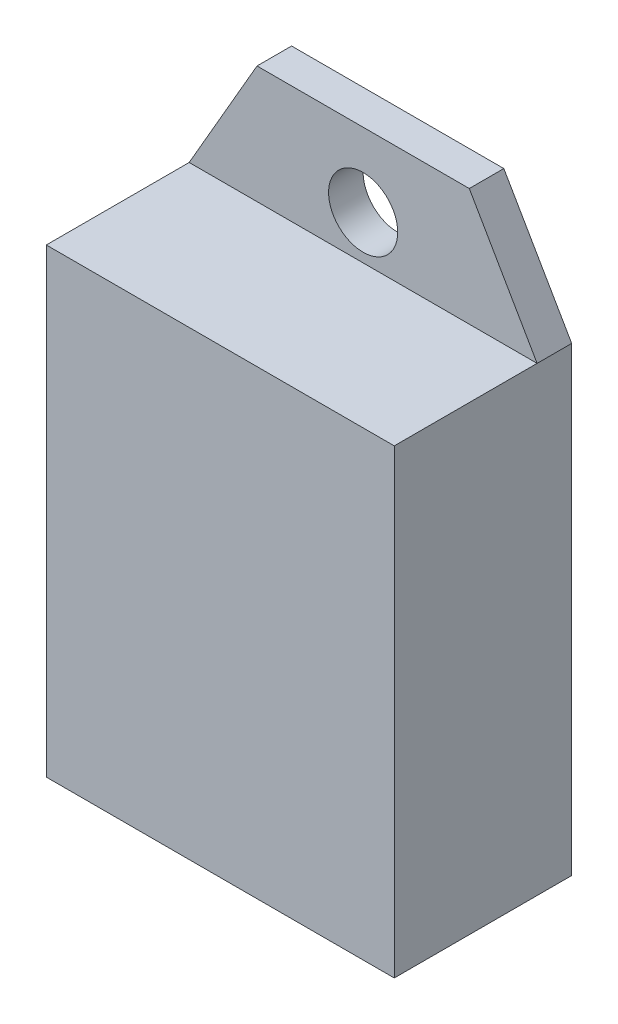
ISO-10303-21;
HEADER;
FILE_DESCRIPTION(('STEP AP214'),'2;1');
FILE_NAME('part.step','',(''),(''),'','','');
FILE_SCHEMA(('AUTOMOTIVE_DESIGN { 1 0 10303 214 1 1 1 1 }'));
ENDSEC;
DATA;
#1=APPLICATION_CONTEXT('core data for automotive mechanical design processes');
#2=APPLICATION_PROTOCOL_DEFINITION('international standard','automotive_design',2000,#1);
#3=PRODUCT_CONTEXT('',#1,'mechanical');
#4=PRODUCT('Part','Part','',(#3));
#5=PRODUCT_RELATED_PRODUCT_CATEGORY('part','',(#4));
#6=PRODUCT_DEFINITION_FORMATION('','',#4);
#7=PRODUCT_DEFINITION_CONTEXT('part definition',#1,'design');
#8=PRODUCT_DEFINITION('design','',#6,#7);
#9=PRODUCT_DEFINITION_SHAPE('','',#8);
#10=(LENGTH_UNIT() NAMED_UNIT(*) SI_UNIT(.MILLI.,.METRE.));
#11=(NAMED_UNIT(*) PLANE_ANGLE_UNIT() SI_UNIT($,.RADIAN.));
#12=(NAMED_UNIT(*) SI_UNIT($,.STERADIAN.) SOLID_ANGLE_UNIT());
#13=UNCERTAINTY_MEASURE_WITH_UNIT(LENGTH_MEASURE(1.E-05),#10,'distance_accuracy_value','');
#14=(GEOMETRIC_REPRESENTATION_CONTEXT(3) GLOBAL_UNCERTAINTY_ASSIGNED_CONTEXT((#13)) GLOBAL_UNIT_ASSIGNED_CONTEXT((#10,
#11,#12)) REPRESENTATION_CONTEXT('',''));
#15=CARTESIAN_POINT('',(0.,0.,0.));
#16=DIRECTION('',(0.,0.,1.));
#17=DIRECTION('',(1.,0.,0.));
#18=AXIS2_PLACEMENT_3D('',#15,#16,#17);
#19=CARTESIAN_POINT('',(7.55,-10.,7.7));
#20=DIRECTION('',(-1.,0.,0.));
#21=DIRECTION('',(0.,0.,1.));
#22=AXIS2_PLACEMENT_3D('',#19,#20,#21);
#23=PLANE('',#22);
#24=DIRECTION('',(0.,1.,0.));
#25=VECTOR('',#24,1.);
#26=CARTESIAN_POINT('',(7.55,-10.,0.));
#27=LINE('',#26,#25);
#28=CARTESIAN_POINT('',(7.55,-10.,0.));
#29=VERTEX_POINT('',#28);
#30=CARTESIAN_POINT('',(7.55,10.,0.));
#31=VERTEX_POINT('',#30);
#32=EDGE_CURVE('E121',#29,#31,#27,.T.);
#33=ORIENTED_EDGE('',*,*,#32,.T.);
#34=DIRECTION('',(0.,0.,-1.));
#35=VECTOR('',#34,1.);
#36=CARTESIAN_POINT('',(7.55,10.,1.5));
#37=LINE('',#36,#35);
#38=CARTESIAN_POINT('',(7.55,10.,1.5));
#39=VERTEX_POINT('',#38);
#40=EDGE_CURVE('E111',#39,#31,#37,.T.);
#41=ORIENTED_EDGE('',*,*,#40,.F.);
#42=DIRECTION('',(0.,0.,-1.));
#43=VECTOR('',#42,1.);
#44=CARTESIAN_POINT('',(7.55,10.,7.7));
#45=LINE('',#44,#43);
#46=CARTESIAN_POINT('',(7.55,10.,7.7));
#47=VERTEX_POINT('',#46);
#48=EDGE_CURVE('E11',#47,#39,#45,.T.);
#49=ORIENTED_EDGE('',*,*,#48,.F.);
#50=DIRECTION('',(0.,1.,0.));
#51=VECTOR('',#50,1.);
#52=CARTESIAN_POINT('',(7.55,-10.,7.7));
#53=LINE('',#52,#51);
#54=CARTESIAN_POINT('',(7.55,-10.,7.7));
#55=VERTEX_POINT('',#54);
#56=EDGE_CURVE('E187',#55,#47,#53,.T.);
#57=ORIENTED_EDGE('',*,*,#56,.F.);
#58=DIRECTION('',(0.,0.,-1.));
#59=VECTOR('',#58,1.);
#60=CARTESIAN_POINT('',(7.55,-10.,7.7));
#61=LINE('',#60,#59);
#62=EDGE_CURVE('E193',#55,#29,#61,.T.);
#63=ORIENTED_EDGE('',*,*,#62,.T.);
#64=EDGE_LOOP('',(#33,#41,#49,#57,#63));
#65=FACE_BOUND('',#64,.T.);
#66=ADVANCED_FACE('F33',(#65),#23,.F.);
#67=CARTESIAN_POINT('',(-7.55,10.,7.7));
#68=DIRECTION('',(0.,-1.,0.));
#69=DIRECTION('',(0.,0.,-1.));
#70=AXIS2_PLACEMENT_3D('',#67,#68,#69);
#71=PLANE('',#70);
#72=ORIENTED_EDGE('',*,*,#48,.T.);
#73=DIRECTION('',(-1.,0.,0.));
#74=VECTOR('',#73,1.);
#75=CARTESIAN_POINT('',(-7.55,10.,1.5));
#76=LINE('',#75,#74);
#77=CARTESIAN_POINT('',(-7.55,10.,1.5));
#78=VERTEX_POINT('',#77);
#79=EDGE_CURVE('E100',#39,#78,#76,.T.);
#80=ORIENTED_EDGE('',*,*,#79,.T.);
#81=DIRECTION('',(0.,0.,-1.));
#82=VECTOR('',#81,1.);
#83=CARTESIAN_POINT('',(-7.55,10.,7.7));
#84=LINE('',#83,#82);
#85=CARTESIAN_POINT('',(-7.55,10.,7.7));
#86=VERTEX_POINT('',#85);
#87=EDGE_CURVE('E40',#86,#78,#84,.T.);
#88=ORIENTED_EDGE('',*,*,#87,.F.);
#89=DIRECTION('',(-1.,0.,0.));
#90=VECTOR('',#89,1.);
#91=CARTESIAN_POINT('',(-7.55,10.,7.7));
#92=LINE('',#91,#90);
#93=EDGE_CURVE('E78',#47,#86,#92,.T.);
#94=ORIENTED_EDGE('',*,*,#93,.F.);
#95=EDGE_LOOP('',(#72,#80,#88,#94));
#96=FACE_BOUND('',#95,.T.);
#97=ADVANCED_FACE('F125',(#96),#71,.F.);
#98=CARTESIAN_POINT('',(-7.55,-10.,7.7));
#99=DIRECTION('',(1.,0.,0.));
#100=DIRECTION('',(0.,0.,-1.));
#101=AXIS2_PLACEMENT_3D('',#98,#99,#100);
#102=PLANE('',#101);
#103=DIRECTION('',(0.,-1.,0.));
#104=VECTOR('',#103,1.);
#105=CARTESIAN_POINT('',(-7.55,-10.,0.));
#106=LINE('',#105,#104);
#107=CARTESIAN_POINT('',(-7.55,10.,0.));
#108=VERTEX_POINT('',#107);
#109=CARTESIAN_POINT('',(-7.55,-10.,0.));
#110=VERTEX_POINT('',#109);
#111=EDGE_CURVE('E195',#108,#110,#106,.T.);
#112=ORIENTED_EDGE('',*,*,#111,.T.);
#113=DIRECTION('',(0.,0.,-1.));
#114=VECTOR('',#113,1.);
#115=CARTESIAN_POINT('',(-7.55,-10.,7.7));
#116=LINE('',#115,#114);
#117=CARTESIAN_POINT('',(-7.55,-10.,7.7));
#118=VERTEX_POINT('',#117);
#119=EDGE_CURVE('E199',#118,#110,#116,.T.);
#120=ORIENTED_EDGE('',*,*,#119,.F.);
#121=DIRECTION('',(0.,-1.,0.));
#122=VECTOR('',#121,1.);
#123=CARTESIAN_POINT('',(-7.55,-10.,7.7));
#124=LINE('',#123,#122);
#125=EDGE_CURVE('E190',#86,#118,#124,.T.);
#126=ORIENTED_EDGE('',*,*,#125,.F.);
#127=ORIENTED_EDGE('',*,*,#87,.T.);
#128=DIRECTION('',(0.,0.,-1.));
#129=VECTOR('',#128,1.);
#130=CARTESIAN_POINT('',(-7.55,10.,1.5));
#131=LINE('',#130,#129);
#132=EDGE_CURVE('E122',#78,#108,#131,.T.);
#133=ORIENTED_EDGE('',*,*,#132,.T.);
#134=EDGE_LOOP('',(#112,#120,#126,#127,#133));
#135=FACE_BOUND('',#134,.T.);
#136=ADVANCED_FACE('F127',(#135),#102,.F.);
#137=CARTESIAN_POINT('',(-7.55,-10.,7.7));
#138=DIRECTION('',(0.,1.,0.));
#139=DIRECTION('',(0.,0.,1.));
#140=AXIS2_PLACEMENT_3D('',#137,#138,#139);
#141=PLANE('',#140);
#142=DIRECTION('',(1.,0.,0.));
#143=VECTOR('',#142,1.);
#144=CARTESIAN_POINT('',(-7.55,-10.,0.));
#145=LINE('',#144,#143);
#146=EDGE_CURVE('E71',#110,#29,#145,.T.);
#147=ORIENTED_EDGE('',*,*,#146,.T.);
#148=ORIENTED_EDGE('',*,*,#62,.F.);
#149=DIRECTION('',(1.,0.,0.));
#150=VECTOR('',#149,1.);
#151=CARTESIAN_POINT('',(-7.55,-10.,7.7));
#152=LINE('',#151,#150);
#153=EDGE_CURVE('E56',#118,#55,#152,.T.);
#154=ORIENTED_EDGE('',*,*,#153,.F.);
#155=ORIENTED_EDGE('',*,*,#119,.T.);
#156=EDGE_LOOP('',(#147,#148,#154,#155));
#157=FACE_BOUND('',#156,.T.);
#158=ADVANCED_FACE('F132',(#157),#141,.F.);
#159=CARTESIAN_POINT('',(0.,0.,7.7));
#160=DIRECTION('',(0.,0.,-1.));
#161=DIRECTION('',(-1.,0.,0.));
#162=AXIS2_PLACEMENT_3D('',#159,#160,#161);
#163=PLANE('',#162);
#164=ORIENTED_EDGE('',*,*,#56,.T.);
#165=ORIENTED_EDGE('',*,*,#93,.T.);
#166=ORIENTED_EDGE('',*,*,#125,.T.);
#167=ORIENTED_EDGE('',*,*,#153,.T.);
#168=EDGE_LOOP('',(#164,#165,#166,#167));
#169=FACE_BOUND('',#168,.T.);
#170=ADVANCED_FACE('F138',(#169),#163,.F.);
#171=CARTESIAN_POINT('',(0.,0.,0.));
#172=DIRECTION('',(0.,0.,-1.));
#173=DIRECTION('',(-1.,0.,0.));
#174=AXIS2_PLACEMENT_3D('',#171,#172,#173);
#175=PLANE('',#174);
#176=CARTESIAN_POINT('',(0.,11.9,0.));
#177=DIRECTION('',(0.,0.,1.));
#178=DIRECTION('',(1.,0.,0.));
#179=AXIS2_PLACEMENT_3D('',#176,#177,#178);
#180=CIRCLE('',#179,1.5);
#181=CARTESIAN_POINT('',(1.5,11.9,0.));
#182=VERTEX_POINT('',#181);
#183=EDGE_CURVE('E166',#182,#182,#180,.T.);
#184=ORIENTED_EDGE('',*,*,#183,.T.);
#185=EDGE_LOOP('',(#184));
#186=FACE_BOUND('',#185,.T.);
#187=ORIENTED_EDGE('',*,*,#32,.F.);
#188=ORIENTED_EDGE('',*,*,#146,.F.);
#189=ORIENTED_EDGE('',*,*,#111,.F.);
#190=DIRECTION('',(0.500000000000004,0.866025403784437,0.));
#191=VECTOR('',#190,1.);
#192=CARTESIAN_POINT('',(-4.60551362713288,15.1,0.));
#193=LINE('',#192,#191);
#194=CARTESIAN_POINT('',(-4.60551362713288,15.1,0.));
#195=VERTEX_POINT('',#194);
#196=EDGE_CURVE('E177',#108,#195,#193,.T.);
#197=ORIENTED_EDGE('',*,*,#196,.T.);
#198=DIRECTION('',(1.,0.,0.));
#199=VECTOR('',#198,1.);
#200=CARTESIAN_POINT('',(-4.60551362713288,15.1,0.));
#201=LINE('',#200,#199);
#202=CARTESIAN_POINT('',(4.60551362713288,15.1,0.));
#203=VERTEX_POINT('',#202);
#204=EDGE_CURVE('E114',#195,#203,#201,.T.);
#205=ORIENTED_EDGE('',*,*,#204,.T.);
#206=DIRECTION('',(0.500000000000004,-0.866025403784436,0.));
#207=VECTOR('',#206,1.);
#208=CARTESIAN_POINT('',(4.60551362713288,15.1,0.));
#209=LINE('',#208,#207);
#210=EDGE_CURVE('E171',#203,#31,#209,.T.);
#211=ORIENTED_EDGE('',*,*,#210,.T.);
#212=EDGE_LOOP('',(#187,#188,#189,#197,#205,#211));
#213=FACE_BOUND('',#212,.T.);
#214=ADVANCED_FACE('F139',(#186,#213),#175,.T.);
#215=CARTESIAN_POINT('',(4.60551362713288,15.1,1.5));
#216=DIRECTION('',(0.866025403784436,0.500000000000004,0.));
#217=DIRECTION('',(-0.500000000000004,0.866025403784436,0.));
#218=AXIS2_PLACEMENT_3D('',#215,#216,#217);
#219=PLANE('',#218);
#220=ORIENTED_EDGE('',*,*,#210,.F.);
#221=DIRECTION('',(0.,0.,-1.));
#222=VECTOR('',#221,1.);
#223=CARTESIAN_POINT('',(4.60551362713288,15.1,1.5));
#224=LINE('',#223,#222);
#225=CARTESIAN_POINT('',(4.60551362713288,15.1,1.5));
#226=VERTEX_POINT('',#225);
#227=EDGE_CURVE('E113',#226,#203,#224,.T.);
#228=ORIENTED_EDGE('',*,*,#227,.F.);
#229=DIRECTION('',(0.500000000000004,-0.866025403784436,0.));
#230=VECTOR('',#229,1.);
#231=CARTESIAN_POINT('',(4.60551362713288,15.1,1.5));
#232=LINE('',#231,#230);
#233=EDGE_CURVE('E103',#226,#39,#232,.T.);
#234=ORIENTED_EDGE('',*,*,#233,.T.);
#235=ORIENTED_EDGE('',*,*,#40,.T.);
#236=EDGE_LOOP('',(#220,#228,#234,#235));
#237=FACE_BOUND('',#236,.T.);
#238=ADVANCED_FACE('F110',(#237),#219,.T.);
#239=CARTESIAN_POINT('',(-4.60551362713288,15.1,1.5));
#240=DIRECTION('',(0.,1.,0.));
#241=DIRECTION('',(-1.,0.,0.));
#242=AXIS2_PLACEMENT_3D('',#239,#240,#241);
#243=PLANE('',#242);
#244=ORIENTED_EDGE('',*,*,#204,.F.);
#245=DIRECTION('',(0.,0.,-1.));
#246=VECTOR('',#245,1.);
#247=CARTESIAN_POINT('',(-4.60551362713288,15.1,1.5));
#248=LINE('',#247,#246);
#249=CARTESIAN_POINT('',(-4.60551362713288,15.1,1.5));
#250=VERTEX_POINT('',#249);
#251=EDGE_CURVE('E183',#250,#195,#248,.T.);
#252=ORIENTED_EDGE('',*,*,#251,.F.);
#253=DIRECTION('',(1.,0.,0.));
#254=VECTOR('',#253,1.);
#255=CARTESIAN_POINT('',(-4.60551362713288,15.1,1.5));
#256=LINE('',#255,#254);
#257=EDGE_CURVE('E123',#250,#226,#256,.T.);
#258=ORIENTED_EDGE('',*,*,#257,.T.);
#259=ORIENTED_EDGE('',*,*,#227,.T.);
#260=EDGE_LOOP('',(#244,#252,#258,#259));
#261=FACE_BOUND('',#260,.T.);
#262=ADVANCED_FACE('F147',(#261),#243,.T.);
#263=CARTESIAN_POINT('',(-4.60551362713288,15.1,1.5));
#264=DIRECTION('',(-0.866025403784436,0.500000000000004,0.));
#265=DIRECTION('',(-0.500000000000004,-0.866025403784437,0.));
#266=AXIS2_PLACEMENT_3D('',#263,#264,#265);
#267=PLANE('',#266);
#268=ORIENTED_EDGE('',*,*,#196,.F.);
#269=ORIENTED_EDGE('',*,*,#132,.F.);
#270=DIRECTION('',(0.500000000000004,0.866025403784437,0.));
#271=VECTOR('',#270,1.);
#272=CARTESIAN_POINT('',(-4.60551362713288,15.1,1.5));
#273=LINE('',#272,#271);
#274=EDGE_CURVE('E47',#78,#250,#273,.T.);
#275=ORIENTED_EDGE('',*,*,#274,.T.);
#276=ORIENTED_EDGE('',*,*,#251,.T.);
#277=EDGE_LOOP('',(#268,#269,#275,#276));
#278=FACE_BOUND('',#277,.T.);
#279=ADVANCED_FACE('F148',(#278),#267,.T.);
#280=CARTESIAN_POINT('',(0.,0.,1.5));
#281=DIRECTION('',(0.,0.,1.));
#282=DIRECTION('',(1.,0.,0.));
#283=AXIS2_PLACEMENT_3D('',#280,#281,#282);
#284=PLANE('',#283);
#285=CARTESIAN_POINT('',(0.,11.9,1.5));
#286=DIRECTION('',(0.,0.,1.));
#287=DIRECTION('',(1.,0.,0.));
#288=AXIS2_PLACEMENT_3D('',#285,#286,#287);
#289=CIRCLE('',#288,1.5);
#290=CARTESIAN_POINT('',(1.5,11.9,1.5));
#291=VERTEX_POINT('',#290);
#292=EDGE_CURVE('E169',#291,#291,#289,.T.);
#293=ORIENTED_EDGE('',*,*,#292,.F.);
#294=EDGE_LOOP('',(#293));
#295=FACE_BOUND('',#294,.T.);
#296=ORIENTED_EDGE('',*,*,#233,.F.);
#297=ORIENTED_EDGE('',*,*,#257,.F.);
#298=ORIENTED_EDGE('',*,*,#274,.F.);
#299=ORIENTED_EDGE('',*,*,#79,.F.);
#300=EDGE_LOOP('',(#296,#297,#298,#299));
#301=FACE_BOUND('',#300,.T.);
#302=ADVANCED_FACE('F102',(#295,#301),#284,.T.);
#303=CARTESIAN_POINT('',(0.,11.9,0.));
#304=DIRECTION('',(0.,0.,1.));
#305=DIRECTION('',(1.,0.,0.));
#306=AXIS2_PLACEMENT_3D('',#303,#304,#305);
#307=CYLINDRICAL_SURFACE('',#306,1.5);
#308=ORIENTED_EDGE('',*,*,#183,.F.);
#309=EDGE_LOOP('',(#308));
#310=FACE_BOUND('',#309,.T.);
#311=ORIENTED_EDGE('',*,*,#292,.T.);
#312=EDGE_LOOP('',(#311));
#313=FACE_BOUND('',#312,.T.);
#314=ADVANCED_FACE('F157',(#310,#313),#307,.F.);
#315=CLOSED_SHELL('',(#66,#97,#136,#158,#170,#214,#238,#262,#279,#302,#314));
#316=MANIFOLD_SOLID_BREP('B2',#315);
#317=ADVANCED_BREP_SHAPE_REPRESENTATION('',(#18,#316),#14);
#318=SHAPE_DEFINITION_REPRESENTATION(#9,#317);
ENDSEC;
END-ISO-10303-21;
